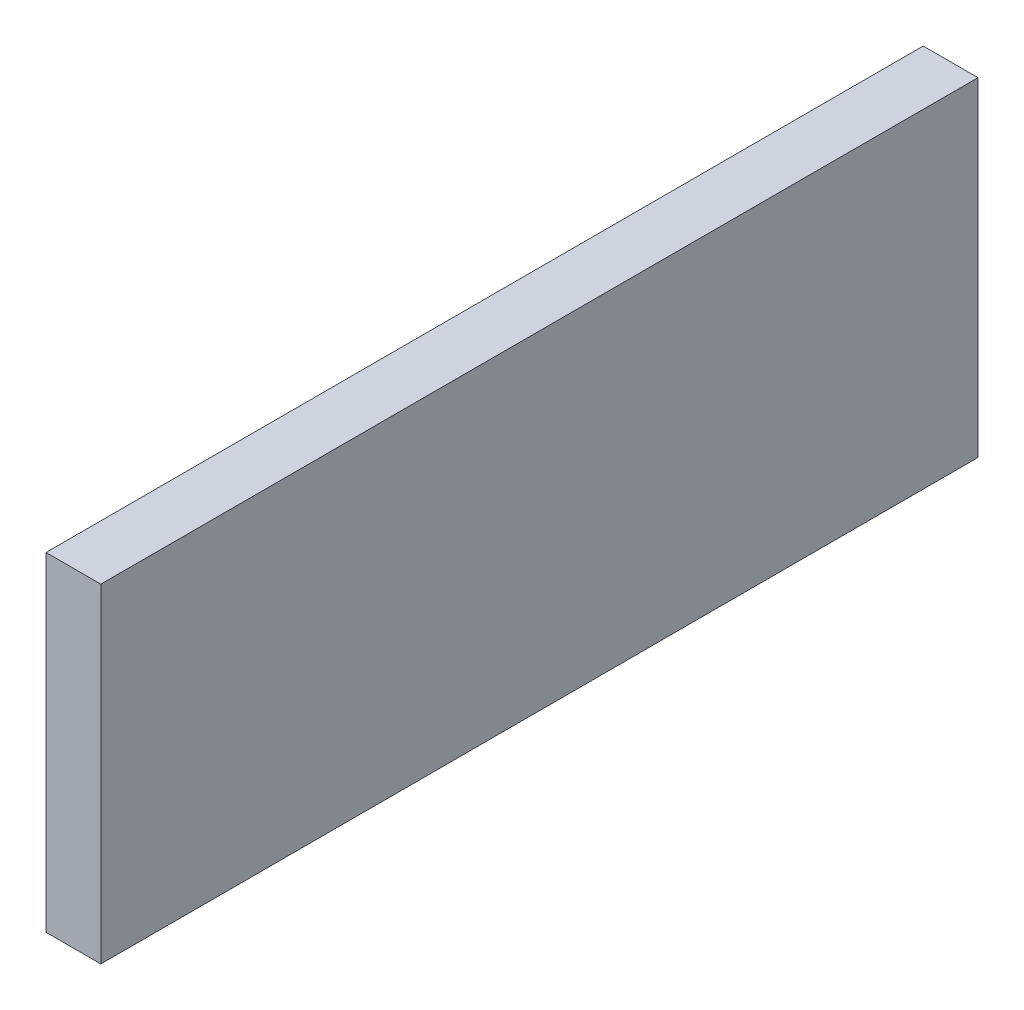
ISO-10303-21;
HEADER;
FILE_DESCRIPTION(('STEP AP214'),'2;1');
FILE_NAME('part.step','',(''),(''),'','','');
FILE_SCHEMA(('AUTOMOTIVE_DESIGN { 1 0 10303 214 1 1 1 1 }'));
ENDSEC;
DATA;
#1=APPLICATION_CONTEXT('core data for automotive mechanical design processes');
#2=APPLICATION_PROTOCOL_DEFINITION('international standard','automotive_design',2000,#1);
#3=PRODUCT_CONTEXT('',#1,'mechanical');
#4=PRODUCT('Part','Part','',(#3));
#5=PRODUCT_RELATED_PRODUCT_CATEGORY('part','',(#4));
#6=PRODUCT_DEFINITION_FORMATION('','',#4);
#7=PRODUCT_DEFINITION_CONTEXT('part definition',#1,'design');
#8=PRODUCT_DEFINITION('design','',#6,#7);
#9=PRODUCT_DEFINITION_SHAPE('','',#8);
#10=(LENGTH_UNIT() NAMED_UNIT(*) SI_UNIT(.MILLI.,.METRE.));
#11=(NAMED_UNIT(*) PLANE_ANGLE_UNIT() SI_UNIT($,.RADIAN.));
#12=(NAMED_UNIT(*) SI_UNIT($,.STERADIAN.) SOLID_ANGLE_UNIT());
#13=UNCERTAINTY_MEASURE_WITH_UNIT(LENGTH_MEASURE(1.E-05),#10,'distance_accuracy_value','');
#14=(GEOMETRIC_REPRESENTATION_CONTEXT(3) GLOBAL_UNCERTAINTY_ASSIGNED_CONTEXT((#13)) GLOBAL_UNIT_ASSIGNED_CONTEXT((#10,
#11,#12)) REPRESENTATION_CONTEXT('',''));
#15=CARTESIAN_POINT('',(0.,0.,0.));
#16=DIRECTION('',(0.,0.,1.));
#17=DIRECTION('',(1.,0.,0.));
#18=AXIS2_PLACEMENT_3D('',#15,#16,#17);
#19=CARTESIAN_POINT('',(5.,15.,0.));
#20=DIRECTION('',(0.,1.,0.));
#21=DIRECTION('',(0.,0.,1.));
#22=AXIS2_PLACEMENT_3D('',#19,#20,#21);
#23=PLANE('',#22);
#24=DIRECTION('',(0.,0.,-1.));
#25=VECTOR('',#24,1.);
#26=CARTESIAN_POINT('',(0.,15.,0.));
#27=LINE('',#26,#25);
#28=CARTESIAN_POINT('',(0.,15.,40.));
#29=VERTEX_POINT('',#28);
#30=CARTESIAN_POINT('',(0.,15.,-40.));
#31=VERTEX_POINT('',#30);
#32=EDGE_CURVE('E117',#29,#31,#27,.T.);
#33=ORIENTED_EDGE('',*,*,#32,.F.);
#34=DIRECTION('',(-1.,0.,0.));
#35=VECTOR('',#34,1.);
#36=CARTESIAN_POINT('',(5.,15.,40.));
#37=LINE('',#36,#35);
#38=CARTESIAN_POINT('',(5.,15.,40.));
#39=VERTEX_POINT('',#38);
#40=EDGE_CURVE('E11',#39,#29,#37,.T.);
#41=ORIENTED_EDGE('',*,*,#40,.F.);
#42=DIRECTION('',(0.,0.,-1.));
#43=VECTOR('',#42,1.);
#44=CARTESIAN_POINT('',(5.,15.,0.));
#45=LINE('',#44,#43);
#46=CARTESIAN_POINT('',(5.,15.,-40.));
#47=VERTEX_POINT('',#46);
#48=EDGE_CURVE('E107',#39,#47,#45,.T.);
#49=ORIENTED_EDGE('',*,*,#48,.T.);
#50=DIRECTION('',(-1.,0.,0.));
#51=VECTOR('',#50,1.);
#52=CARTESIAN_POINT('',(5.,15.,-40.));
#53=LINE('',#52,#51);
#54=EDGE_CURVE('E86',#47,#31,#53,.T.);
#55=ORIENTED_EDGE('',*,*,#54,.T.);
#56=EDGE_LOOP('',(#33,#41,#49,#55));
#57=FACE_BOUND('',#56,.T.);
#58=ADVANCED_FACE('F47',(#57),#23,.T.);
#59=CARTESIAN_POINT('',(5.,0.,40.));
#60=DIRECTION('',(0.,0.,1.));
#61=DIRECTION('',(1.,0.,0.));
#62=AXIS2_PLACEMENT_3D('',#59,#60,#61);
#63=PLANE('',#62);
#64=DIRECTION('',(0.,1.,0.));
#65=VECTOR('',#64,1.);
#66=CARTESIAN_POINT('',(0.,0.,40.));
#67=LINE('',#66,#65);
#68=CARTESIAN_POINT('',(0.,-15.,40.));
#69=VERTEX_POINT('',#68);
#70=EDGE_CURVE('E99',#69,#29,#67,.T.);
#71=ORIENTED_EDGE('',*,*,#70,.F.);
#72=DIRECTION('',(-1.,0.,0.));
#73=VECTOR('',#72,1.);
#74=CARTESIAN_POINT('',(5.,-15.,40.));
#75=LINE('',#74,#73);
#76=CARTESIAN_POINT('',(5.,-15.,40.));
#77=VERTEX_POINT('',#76);
#78=EDGE_CURVE('E56',#77,#69,#75,.T.);
#79=ORIENTED_EDGE('',*,*,#78,.F.);
#80=DIRECTION('',(0.,1.,0.));
#81=VECTOR('',#80,1.);
#82=CARTESIAN_POINT('',(5.,0.,40.));
#83=LINE('',#82,#81);
#84=EDGE_CURVE('E97',#77,#39,#83,.T.);
#85=ORIENTED_EDGE('',*,*,#84,.T.);
#86=ORIENTED_EDGE('',*,*,#40,.T.);
#87=EDGE_LOOP('',(#71,#79,#85,#86));
#88=FACE_BOUND('',#87,.T.);
#89=ADVANCED_FACE('F95',(#88),#63,.T.);
#90=CARTESIAN_POINT('',(5.,-15.,0.));
#91=DIRECTION('',(0.,1.,0.));
#92=DIRECTION('',(0.,0.,1.));
#93=AXIS2_PLACEMENT_3D('',#90,#91,#92);
#94=PLANE('',#93);
#95=DIRECTION('',(0.,0.,-1.));
#96=VECTOR('',#95,1.);
#97=CARTESIAN_POINT('',(0.,-15.,0.));
#98=LINE('',#97,#96);
#99=CARTESIAN_POINT('',(0.,-15.,-40.));
#100=VERTEX_POINT('',#99);
#101=EDGE_CURVE('E79',#69,#100,#98,.T.);
#102=ORIENTED_EDGE('',*,*,#101,.T.);
#103=DIRECTION('',(-1.,0.,0.));
#104=VECTOR('',#103,1.);
#105=CARTESIAN_POINT('',(5.,-15.,-40.));
#106=LINE('',#105,#104);
#107=CARTESIAN_POINT('',(5.,-15.,-40.));
#108=VERTEX_POINT('',#107);
#109=EDGE_CURVE('E101',#108,#100,#106,.T.);
#110=ORIENTED_EDGE('',*,*,#109,.F.);
#111=DIRECTION('',(0.,0.,-1.));
#112=VECTOR('',#111,1.);
#113=CARTESIAN_POINT('',(5.,-15.,0.));
#114=LINE('',#113,#112);
#115=EDGE_CURVE('E102',#77,#108,#114,.T.);
#116=ORIENTED_EDGE('',*,*,#115,.F.);
#117=ORIENTED_EDGE('',*,*,#78,.T.);
#118=EDGE_LOOP('',(#102,#110,#116,#117));
#119=FACE_BOUND('',#118,.T.);
#120=ADVANCED_FACE('F103',(#119),#94,.F.);
#121=CARTESIAN_POINT('',(5.,0.,-40.));
#122=DIRECTION('',(0.,0.,1.));
#123=DIRECTION('',(1.,0.,0.));
#124=AXIS2_PLACEMENT_3D('',#121,#122,#123);
#125=PLANE('',#124);
#126=DIRECTION('',(0.,1.,0.));
#127=VECTOR('',#126,1.);
#128=CARTESIAN_POINT('',(0.,0.,-40.));
#129=LINE('',#128,#127);
#130=EDGE_CURVE('E111',#100,#31,#129,.T.);
#131=ORIENTED_EDGE('',*,*,#130,.T.);
#132=ORIENTED_EDGE('',*,*,#54,.F.);
#133=DIRECTION('',(0.,1.,0.));
#134=VECTOR('',#133,1.);
#135=CARTESIAN_POINT('',(5.,0.,-40.));
#136=LINE('',#135,#134);
#137=EDGE_CURVE('E64',#108,#47,#136,.T.);
#138=ORIENTED_EDGE('',*,*,#137,.F.);
#139=ORIENTED_EDGE('',*,*,#109,.T.);
#140=EDGE_LOOP('',(#131,#132,#138,#139));
#141=FACE_BOUND('',#140,.T.);
#142=ADVANCED_FACE('F133',(#141),#125,.F.);
#143=CARTESIAN_POINT('',(5.,0.,0.));
#144=DIRECTION('',(1.,0.,0.));
#145=DIRECTION('',(0.,0.,-1.));
#146=AXIS2_PLACEMENT_3D('',#143,#144,#145);
#147=PLANE('',#146);
#148=ORIENTED_EDGE('',*,*,#48,.F.);
#149=ORIENTED_EDGE('',*,*,#84,.F.);
#150=ORIENTED_EDGE('',*,*,#115,.T.);
#151=ORIENTED_EDGE('',*,*,#137,.T.);
#152=EDGE_LOOP('',(#148,#149,#150,#151));
#153=FACE_BOUND('',#152,.T.);
#154=ADVANCED_FACE('F106',(#153),#147,.T.);
#155=CARTESIAN_POINT('',(0.,0.,0.));
#156=DIRECTION('',(1.,0.,0.));
#157=DIRECTION('',(0.,0.,-1.));
#158=AXIS2_PLACEMENT_3D('',#155,#156,#157);
#159=PLANE('',#158);
#160=CARTESIAN_POINT('',(0.,0.,-15.35));
#161=DIRECTION('',(1.,0.,0.));
#162=DIRECTION('',(0.,0.,-1.));
#163=AXIS2_PLACEMENT_3D('',#160,#161,#162);
#164=CIRCLE('',#163,4.8);
#165=CARTESIAN_POINT('',(0.,0.,-20.15));
#166=VERTEX_POINT('',#165);
#167=EDGE_CURVE('E175',#166,#166,#164,.T.);
#168=ORIENTED_EDGE('',*,*,#167,.T.);
#169=EDGE_LOOP('',(#168));
#170=FACE_BOUND('',#169,.T.);
#171=CARTESIAN_POINT('',(0.,0.,15.35));
#172=DIRECTION('',(1.,0.,0.));
#173=DIRECTION('',(0.,0.,-1.));
#174=AXIS2_PLACEMENT_3D('',#171,#172,#173);
#175=CIRCLE('',#174,4.8);
#176=CARTESIAN_POINT('',(0.,0.,10.55));
#177=VERTEX_POINT('',#176);
#178=EDGE_CURVE('E177',#177,#177,#175,.T.);
#179=ORIENTED_EDGE('',*,*,#178,.T.);
#180=EDGE_LOOP('',(#179));
#181=FACE_BOUND('',#180,.T.);
#182=ORIENTED_EDGE('',*,*,#32,.T.);
#183=ORIENTED_EDGE('',*,*,#130,.F.);
#184=ORIENTED_EDGE('',*,*,#101,.F.);
#185=ORIENTED_EDGE('',*,*,#70,.T.);
#186=EDGE_LOOP('',(#182,#183,#184,#185));
#187=FACE_BOUND('',#186,.T.);
#188=ADVANCED_FACE('F135',(#170,#181,#187),#159,.F.);
#189=CARTESIAN_POINT('',(-5.,0.,15.35));
#190=DIRECTION('',(1.,0.,0.));
#191=DIRECTION('',(0.,0.,-1.));
#192=AXIS2_PLACEMENT_3D('',#189,#190,#191);
#193=CYLINDRICAL_SURFACE('',#192,4.8);
#194=CARTESIAN_POINT('',(-5.,0.,15.35));
#195=DIRECTION('',(1.,0.,0.));
#196=DIRECTION('',(0.,0.,-1.));
#197=AXIS2_PLACEMENT_3D('',#194,#195,#196);
#198=CIRCLE('',#197,4.8);
#199=CARTESIAN_POINT('',(-5.,0.,10.55));
#200=VERTEX_POINT('',#199);
#201=EDGE_CURVE('E121',#200,#200,#198,.T.);
#202=ORIENTED_EDGE('',*,*,#201,.T.);
#203=EDGE_LOOP('',(#202));
#204=FACE_BOUND('',#203,.T.);
#205=ORIENTED_EDGE('',*,*,#178,.F.);
#206=EDGE_LOOP('',(#205));
#207=FACE_BOUND('',#206,.T.);
#208=ADVANCED_FACE('F149',(#204,#207),#193,.T.);
#209=CARTESIAN_POINT('',(-5.,0.,15.35));
#210=DIRECTION('',(1.,0.,0.));
#211=DIRECTION('',(0.,0.,-1.));
#212=AXIS2_PLACEMENT_3D('',#209,#210,#211);
#213=PLANE('',#212);
#214=ORIENTED_EDGE('',*,*,#201,.F.);
#215=EDGE_LOOP('',(#214));
#216=FACE_BOUND('',#215,.T.);
#217=ADVANCED_FACE('F155',(#216),#213,.F.);
#218=CARTESIAN_POINT('',(-5.,0.,-15.35));
#219=DIRECTION('',(1.,0.,0.));
#220=DIRECTION('',(0.,0.,-1.));
#221=AXIS2_PLACEMENT_3D('',#218,#219,#220);
#222=CYLINDRICAL_SURFACE('',#221,4.8);
#223=CARTESIAN_POINT('',(-5.,0.,-15.35));
#224=DIRECTION('',(1.,0.,0.));
#225=DIRECTION('',(0.,0.,-1.));
#226=AXIS2_PLACEMENT_3D('',#223,#224,#225);
#227=CIRCLE('',#226,4.8);
#228=CARTESIAN_POINT('',(-5.,0.,-20.15));
#229=VERTEX_POINT('',#228);
#230=EDGE_CURVE('E172',#229,#229,#227,.T.);
#231=ORIENTED_EDGE('',*,*,#230,.T.);
#232=EDGE_LOOP('',(#231));
#233=FACE_BOUND('',#232,.T.);
#234=ORIENTED_EDGE('',*,*,#167,.F.);
#235=EDGE_LOOP('',(#234));
#236=FACE_BOUND('',#235,.T.);
#237=ADVANCED_FACE('F159',(#233,#236),#222,.T.);
#238=CARTESIAN_POINT('',(-5.,0.,-15.35));
#239=DIRECTION('',(1.,0.,0.));
#240=DIRECTION('',(0.,0.,-1.));
#241=AXIS2_PLACEMENT_3D('',#238,#239,#240);
#242=PLANE('',#241);
#243=ORIENTED_EDGE('',*,*,#230,.F.);
#244=EDGE_LOOP('',(#243));
#245=FACE_BOUND('',#244,.T.);
#246=ADVANCED_FACE('F161',(#245),#242,.F.);
#247=CLOSED_SHELL('',(#58,#89,#120,#142,#154,#188,#208,#217,#237,#246));
#248=MANIFOLD_SOLID_BREP('B2',#247);
#249=ADVANCED_BREP_SHAPE_REPRESENTATION('',(#18,#248),#14);
#250=SHAPE_DEFINITION_REPRESENTATION(#9,#249);
ENDSEC;
END-ISO-10303-21;
